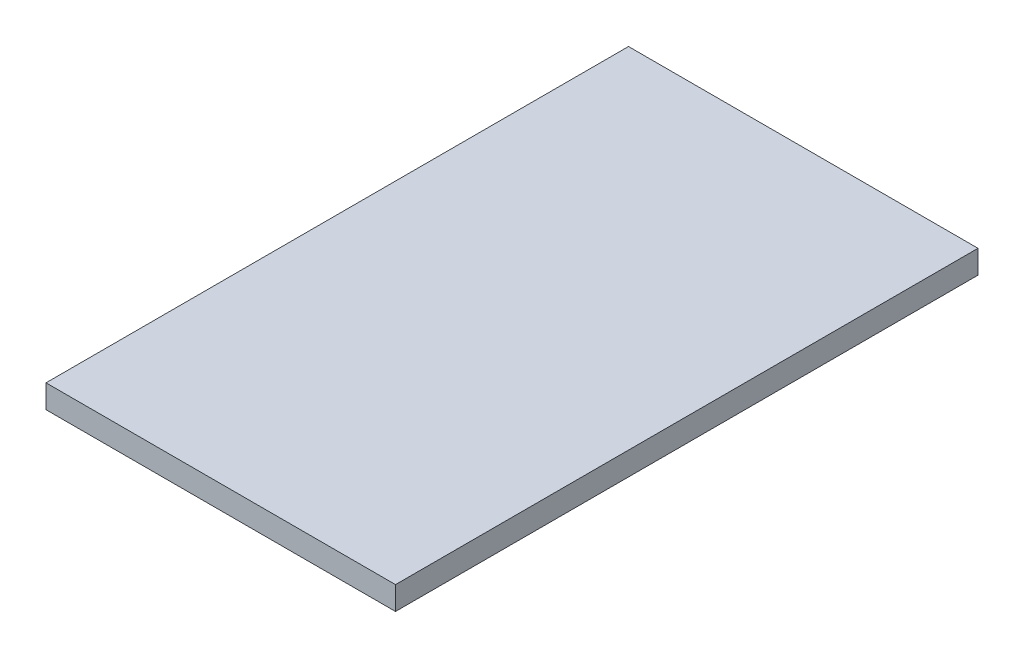
ISO-10303-21;
HEADER;
FILE_DESCRIPTION(('STEP AP214'),'2;1');
FILE_NAME('part.step','',(''),(''),'','','');
FILE_SCHEMA(('AUTOMOTIVE_DESIGN { 1 0 10303 214 1 1 1 1 }'));
ENDSEC;
DATA;
#1=APPLICATION_CONTEXT('core data for automotive mechanical design processes');
#2=APPLICATION_PROTOCOL_DEFINITION('international standard','automotive_design',2000,#1);
#3=PRODUCT_CONTEXT('',#1,'mechanical');
#4=PRODUCT('Part','Part','',(#3));
#5=PRODUCT_RELATED_PRODUCT_CATEGORY('part','',(#4));
#6=PRODUCT_DEFINITION_FORMATION('','',#4);
#7=PRODUCT_DEFINITION_CONTEXT('part definition',#1,'design');
#8=PRODUCT_DEFINITION('design','',#6,#7);
#9=PRODUCT_DEFINITION_SHAPE('','',#8);
#10=(LENGTH_UNIT() NAMED_UNIT(*) SI_UNIT(.MILLI.,.METRE.));
#11=(NAMED_UNIT(*) PLANE_ANGLE_UNIT() SI_UNIT($,.RADIAN.));
#12=(NAMED_UNIT(*) SI_UNIT($,.STERADIAN.) SOLID_ANGLE_UNIT());
#13=UNCERTAINTY_MEASURE_WITH_UNIT(LENGTH_MEASURE(1.E-05),#10,'distance_accuracy_value','');
#14=(GEOMETRIC_REPRESENTATION_CONTEXT(3) GLOBAL_UNCERTAINTY_ASSIGNED_CONTEXT((#13)) GLOBAL_UNIT_ASSIGNED_CONTEXT((#10,
#11,#12)) REPRESENTATION_CONTEXT('',''));
#15=CARTESIAN_POINT('',(0.,0.,0.));
#16=DIRECTION('',(0.,0.,1.));
#17=DIRECTION('',(1.,0.,0.));
#18=AXIS2_PLACEMENT_3D('',#15,#16,#17);
#19=CARTESIAN_POINT('',(0.,2.,0.));
#20=DIRECTION('',(1.,0.,0.));
#21=DIRECTION('',(0.,0.,-1.));
#22=AXIS2_PLACEMENT_3D('',#19,#20,#21);
#23=PLANE('',#22);
#24=DIRECTION('',(0.,0.,1.));
#25=VECTOR('',#24,1.);
#26=CARTESIAN_POINT('',(0.,0.,0.));
#27=LINE('',#26,#25);
#28=CARTESIAN_POINT('',(0.,0.,-50.));
#29=VERTEX_POINT('',#28);
#30=CARTESIAN_POINT('',(0.,0.,0.));
#31=VERTEX_POINT('',#30);
#32=EDGE_CURVE('E99',#29,#31,#27,.T.);
#33=ORIENTED_EDGE('',*,*,#32,.T.);
#34=DIRECTION('',(0.,-1.,0.));
#35=VECTOR('',#34,1.);
#36=CARTESIAN_POINT('',(0.,2.,0.));
#37=LINE('',#36,#35);
#38=CARTESIAN_POINT('',(0.,2.,0.));
#39=VERTEX_POINT('',#38);
#40=EDGE_CURVE('E11',#39,#31,#37,.T.);
#41=ORIENTED_EDGE('',*,*,#40,.F.);
#42=DIRECTION('',(0.,0.,1.));
#43=VECTOR('',#42,1.);
#44=CARTESIAN_POINT('',(0.,2.,0.));
#45=LINE('',#44,#43);
#46=CARTESIAN_POINT('',(0.,2.,-50.));
#47=VERTEX_POINT('',#46);
#48=EDGE_CURVE('E87',#47,#39,#45,.T.);
#49=ORIENTED_EDGE('',*,*,#48,.F.);
#50=DIRECTION('',(0.,-1.,0.));
#51=VECTOR('',#50,1.);
#52=CARTESIAN_POINT('',(0.,2.,-50.));
#53=LINE('',#52,#51);
#54=EDGE_CURVE('E95',#47,#29,#53,.T.);
#55=ORIENTED_EDGE('',*,*,#54,.T.);
#56=EDGE_LOOP('',(#33,#41,#49,#55));
#57=FACE_BOUND('',#56,.T.);
#58=ADVANCED_FACE('F36',(#57),#23,.F.);
#59=CARTESIAN_POINT('',(0.,2.,0.));
#60=DIRECTION('',(0.,0.,-1.));
#61=DIRECTION('',(-1.,0.,0.));
#62=AXIS2_PLACEMENT_3D('',#59,#60,#61);
#63=PLANE('',#62);
#64=DIRECTION('',(1.,0.,0.));
#65=VECTOR('',#64,1.);
#66=CARTESIAN_POINT('',(0.,0.,0.));
#67=LINE('',#66,#65);
#68=CARTESIAN_POINT('',(30.,0.,0.));
#69=VERTEX_POINT('',#68);
#70=EDGE_CURVE('E91',#31,#69,#67,.T.);
#71=ORIENTED_EDGE('',*,*,#70,.T.);
#72=DIRECTION('',(0.,-1.,0.));
#73=VECTOR('',#72,1.);
#74=CARTESIAN_POINT('',(30.,2.,0.));
#75=LINE('',#74,#73);
#76=CARTESIAN_POINT('',(30.,2.,0.));
#77=VERTEX_POINT('',#76);
#78=EDGE_CURVE('E44',#77,#69,#75,.T.);
#79=ORIENTED_EDGE('',*,*,#78,.F.);
#80=DIRECTION('',(1.,0.,0.));
#81=VECTOR('',#80,1.);
#82=CARTESIAN_POINT('',(0.,2.,0.));
#83=LINE('',#82,#81);
#84=EDGE_CURVE('E82',#39,#77,#83,.T.);
#85=ORIENTED_EDGE('',*,*,#84,.F.);
#86=ORIENTED_EDGE('',*,*,#40,.T.);
#87=EDGE_LOOP('',(#71,#79,#85,#86));
#88=FACE_BOUND('',#87,.T.);
#89=ADVANCED_FACE('F90',(#88),#63,.F.);
#90=CARTESIAN_POINT('',(30.,2.,0.));
#91=DIRECTION('',(-1.,0.,0.));
#92=DIRECTION('',(0.,0.,1.));
#93=AXIS2_PLACEMENT_3D('',#90,#91,#92);
#94=PLANE('',#93);
#95=DIRECTION('',(0.,0.,-1.));
#96=VECTOR('',#95,1.);
#97=CARTESIAN_POINT('',(30.,0.,0.));
#98=LINE('',#97,#96);
#99=CARTESIAN_POINT('',(30.,0.,-50.));
#100=VERTEX_POINT('',#99);
#101=EDGE_CURVE('E69',#69,#100,#98,.T.);
#102=ORIENTED_EDGE('',*,*,#101,.T.);
#103=DIRECTION('',(0.,-1.,0.));
#104=VECTOR('',#103,1.);
#105=CARTESIAN_POINT('',(30.,2.,-50.));
#106=LINE('',#105,#104);
#107=CARTESIAN_POINT('',(30.,2.,-50.));
#108=VERTEX_POINT('',#107);
#109=EDGE_CURVE('E92',#108,#100,#106,.T.);
#110=ORIENTED_EDGE('',*,*,#109,.F.);
#111=DIRECTION('',(0.,0.,-1.));
#112=VECTOR('',#111,1.);
#113=CARTESIAN_POINT('',(30.,2.,0.));
#114=LINE('',#113,#112);
#115=EDGE_CURVE('E85',#77,#108,#114,.T.);
#116=ORIENTED_EDGE('',*,*,#115,.F.);
#117=ORIENTED_EDGE('',*,*,#78,.T.);
#118=EDGE_LOOP('',(#102,#110,#116,#117));
#119=FACE_BOUND('',#118,.T.);
#120=ADVANCED_FACE('F93',(#119),#94,.F.);
#121=CARTESIAN_POINT('',(0.,2.,-50.));
#122=DIRECTION('',(0.,0.,1.));
#123=DIRECTION('',(1.,0.,0.));
#124=AXIS2_PLACEMENT_3D('',#121,#122,#123);
#125=PLANE('',#124);
#126=DIRECTION('',(-1.,0.,0.));
#127=VECTOR('',#126,1.);
#128=CARTESIAN_POINT('',(0.,0.,-50.));
#129=LINE('',#128,#127);
#130=EDGE_CURVE('E75',#100,#29,#129,.T.);
#131=ORIENTED_EDGE('',*,*,#130,.T.);
#132=ORIENTED_EDGE('',*,*,#54,.F.);
#133=DIRECTION('',(-1.,0.,0.));
#134=VECTOR('',#133,1.);
#135=CARTESIAN_POINT('',(0.,2.,-50.));
#136=LINE('',#135,#134);
#137=EDGE_CURVE('E52',#108,#47,#136,.T.);
#138=ORIENTED_EDGE('',*,*,#137,.F.);
#139=ORIENTED_EDGE('',*,*,#109,.T.);
#140=EDGE_LOOP('',(#131,#132,#138,#139));
#141=FACE_BOUND('',#140,.T.);
#142=ADVANCED_FACE('F106',(#141),#125,.F.);
#143=CARTESIAN_POINT('',(0.,2.,0.));
#144=DIRECTION('',(0.,-1.,0.));
#145=DIRECTION('',(0.,0.,-1.));
#146=AXIS2_PLACEMENT_3D('',#143,#144,#145);
#147=PLANE('',#146);
#148=ORIENTED_EDGE('',*,*,#48,.T.);
#149=ORIENTED_EDGE('',*,*,#84,.T.);
#150=ORIENTED_EDGE('',*,*,#115,.T.);
#151=ORIENTED_EDGE('',*,*,#137,.T.);
#152=EDGE_LOOP('',(#148,#149,#150,#151));
#153=FACE_BOUND('',#152,.T.);
#154=ADVANCED_FACE('F83',(#153),#147,.F.);
#155=CARTESIAN_POINT('',(0.,0.,0.));
#156=DIRECTION('',(0.,-1.,0.));
#157=DIRECTION('',(0.,0.,-1.));
#158=AXIS2_PLACEMENT_3D('',#155,#156,#157);
#159=PLANE('',#158);
#160=ORIENTED_EDGE('',*,*,#32,.F.);
#161=ORIENTED_EDGE('',*,*,#130,.F.);
#162=ORIENTED_EDGE('',*,*,#101,.F.);
#163=ORIENTED_EDGE('',*,*,#70,.F.);
#164=EDGE_LOOP('',(#160,#161,#162,#163));
#165=FACE_BOUND('',#164,.T.);
#166=ADVANCED_FACE('F109',(#165),#159,.T.);
#167=CLOSED_SHELL('',(#58,#89,#120,#142,#154,#166));
#168=MANIFOLD_SOLID_BREP('B2',#167);
#169=ADVANCED_BREP_SHAPE_REPRESENTATION('',(#18,#168),#14);
#170=SHAPE_DEFINITION_REPRESENTATION(#9,#169);
ENDSEC;
END-ISO-10303-21;
